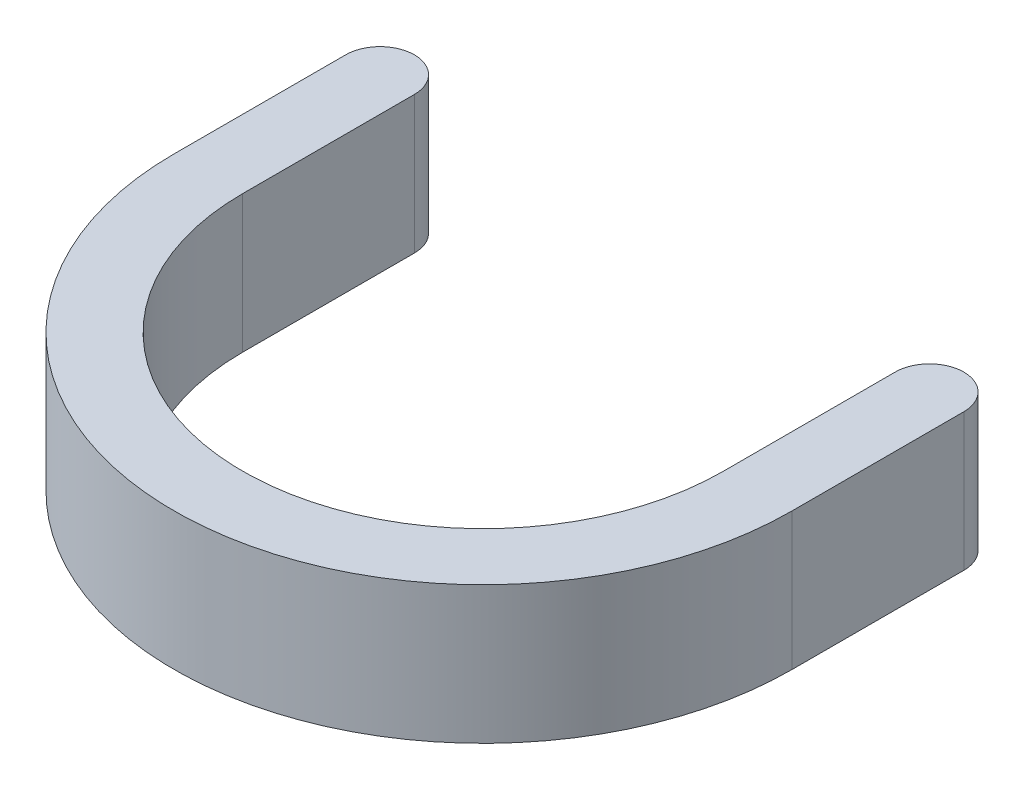
ISO-10303-21;
HEADER;
FILE_DESCRIPTION(('STEP AP214'),'2;1');
FILE_NAME('part.step','',(''),(''),'','','');
FILE_SCHEMA(('AUTOMOTIVE_DESIGN { 1 0 10303 214 1 1 1 1 }'));
ENDSEC;
DATA;
#1=APPLICATION_CONTEXT('core data for automotive mechanical design processes');
#2=APPLICATION_PROTOCOL_DEFINITION('international standard','automotive_design',2000,#1);
#3=PRODUCT_CONTEXT('',#1,'mechanical');
#4=PRODUCT('Part','Part','',(#3));
#5=PRODUCT_RELATED_PRODUCT_CATEGORY('part','',(#4));
#6=PRODUCT_DEFINITION_FORMATION('','',#4);
#7=PRODUCT_DEFINITION_CONTEXT('part definition',#1,'design');
#8=PRODUCT_DEFINITION('design','',#6,#7);
#9=PRODUCT_DEFINITION_SHAPE('','',#8);
#10=(LENGTH_UNIT() NAMED_UNIT(*) SI_UNIT(.MILLI.,.METRE.));
#11=(NAMED_UNIT(*) PLANE_ANGLE_UNIT() SI_UNIT($,.RADIAN.));
#12=(NAMED_UNIT(*) SI_UNIT($,.STERADIAN.) SOLID_ANGLE_UNIT());
#13=UNCERTAINTY_MEASURE_WITH_UNIT(LENGTH_MEASURE(1.E-05),#10,'distance_accuracy_value','');
#14=(GEOMETRIC_REPRESENTATION_CONTEXT(3) GLOBAL_UNCERTAINTY_ASSIGNED_CONTEXT((#13)) GLOBAL_UNIT_ASSIGNED_CONTEXT((#10,
#11,#12)) REPRESENTATION_CONTEXT('',''));
#15=CARTESIAN_POINT('',(0.,0.,0.));
#16=DIRECTION('',(0.,0.,1.));
#17=DIRECTION('',(1.,0.,0.));
#18=AXIS2_PLACEMENT_3D('',#15,#16,#17);
#19=CARTESIAN_POINT('',(8.,4.,-5.));
#20=DIRECTION('',(0.,-1.,0.));
#21=DIRECTION('',(0.,0.,-1.));
#22=AXIS2_PLACEMENT_3D('',#19,#20,#21);
#23=CYLINDRICAL_SURFACE('',#22,1.);
#24=CARTESIAN_POINT('',(8.,0.,-5.));
#25=DIRECTION('',(0.,1.,0.));
#26=DIRECTION('',(0.,0.,1.));
#27=AXIS2_PLACEMENT_3D('',#24,#25,#26);
#28=CIRCLE('',#27,1.);
#29=CARTESIAN_POINT('',(9.,0.,-5.));
#30=VERTEX_POINT('',#29);
#31=CARTESIAN_POINT('',(7.,0.,-5.));
#32=VERTEX_POINT('',#31);
#33=EDGE_CURVE('E128',#30,#32,#28,.T.);
#34=ORIENTED_EDGE('',*,*,#33,.T.);
#35=DIRECTION('',(0.,-1.,0.));
#36=VECTOR('',#35,1.);
#37=CARTESIAN_POINT('',(7.,4.,-5.));
#38=LINE('',#37,#36);
#39=CARTESIAN_POINT('',(7.,4.,-5.));
#40=VERTEX_POINT('',#39);
#41=EDGE_CURVE('E11',#40,#32,#38,.T.);
#42=ORIENTED_EDGE('',*,*,#41,.F.);
#43=CARTESIAN_POINT('',(8.,4.,-5.));
#44=DIRECTION('',(0.,1.,0.));
#45=DIRECTION('',(0.,0.,1.));
#46=AXIS2_PLACEMENT_3D('',#43,#44,#45);
#47=CIRCLE('',#46,1.);
#48=CARTESIAN_POINT('',(9.,4.,-5.));
#49=VERTEX_POINT('',#48);
#50=EDGE_CURVE('E142',#49,#40,#47,.T.);
#51=ORIENTED_EDGE('',*,*,#50,.F.);
#52=DIRECTION('',(0.,-1.,0.));
#53=VECTOR('',#52,1.);
#54=CARTESIAN_POINT('',(9.,4.,-5.));
#55=LINE('',#54,#53);
#56=EDGE_CURVE('E124',#49,#30,#55,.T.);
#57=ORIENTED_EDGE('',*,*,#56,.T.);
#58=EDGE_LOOP('',(#34,#42,#51,#57));
#59=FACE_BOUND('',#58,.T.);
#60=ADVANCED_FACE('F32',(#59),#23,.T.);
#61=CARTESIAN_POINT('',(7.,4.,0.));
#62=DIRECTION('',(1.,0.,0.));
#63=DIRECTION('',(0.,0.,-1.));
#64=AXIS2_PLACEMENT_3D('',#61,#62,#63);
#65=PLANE('',#64);
#66=DIRECTION('',(0.,0.,1.));
#67=VECTOR('',#66,1.);
#68=CARTESIAN_POINT('',(7.,0.,0.));
#69=LINE('',#68,#67);
#70=CARTESIAN_POINT('',(7.,0.,0.));
#71=VERTEX_POINT('',#70);
#72=EDGE_CURVE('E131',#32,#71,#69,.T.);
#73=ORIENTED_EDGE('',*,*,#72,.T.);
#74=DIRECTION('',(0.,-1.,0.));
#75=VECTOR('',#74,1.);
#76=CARTESIAN_POINT('',(7.,4.,0.));
#77=LINE('',#76,#75);
#78=CARTESIAN_POINT('',(7.,4.,0.));
#79=VERTEX_POINT('',#78);
#80=EDGE_CURVE('E40',#79,#71,#77,.T.);
#81=ORIENTED_EDGE('',*,*,#80,.F.);
#82=DIRECTION('',(0.,0.,1.));
#83=VECTOR('',#82,1.);
#84=CARTESIAN_POINT('',(7.,4.,0.));
#85=LINE('',#84,#83);
#86=EDGE_CURVE('E91',#40,#79,#85,.T.);
#87=ORIENTED_EDGE('',*,*,#86,.F.);
#88=ORIENTED_EDGE('',*,*,#41,.T.);
#89=EDGE_LOOP('',(#73,#81,#87,#88));
#90=FACE_BOUND('',#89,.T.);
#91=ADVANCED_FACE('F177',(#90),#65,.F.);
#92=CARTESIAN_POINT('',(0.,4.,0.));
#93=DIRECTION('',(0.,-1.,0.));
#94=DIRECTION('',(0.,0.,-1.));
#95=AXIS2_PLACEMENT_3D('',#92,#93,#94);
#96=CYLINDRICAL_SURFACE('',#95,7.);
#97=CARTESIAN_POINT('',(0.,0.,0.));
#98=DIRECTION('',(0.,-1.,0.));
#99=DIRECTION('',(0.,0.,1.));
#100=AXIS2_PLACEMENT_3D('',#97,#98,#99);
#101=CIRCLE('',#100,7.);
#102=CARTESIAN_POINT('',(-7.,0.,0.));
#103=VERTEX_POINT('',#102);
#104=EDGE_CURVE('E133',#71,#103,#101,.T.);
#105=ORIENTED_EDGE('',*,*,#104,.T.);
#106=DIRECTION('',(0.,-1.,0.));
#107=VECTOR('',#106,1.);
#108=CARTESIAN_POINT('',(-7.,4.,0.));
#109=LINE('',#108,#107);
#110=CARTESIAN_POINT('',(-7.,4.,0.));
#111=VERTEX_POINT('',#110);
#112=EDGE_CURVE('E149',#111,#103,#109,.T.);
#113=ORIENTED_EDGE('',*,*,#112,.F.);
#114=CARTESIAN_POINT('',(0.,4.,0.));
#115=DIRECTION('',(0.,-1.,0.));
#116=DIRECTION('',(0.,0.,1.));
#117=AXIS2_PLACEMENT_3D('',#114,#115,#116);
#118=CIRCLE('',#117,7.);
#119=EDGE_CURVE('E157',#79,#111,#118,.T.);
#120=ORIENTED_EDGE('',*,*,#119,.F.);
#121=ORIENTED_EDGE('',*,*,#80,.T.);
#122=EDGE_LOOP('',(#105,#113,#120,#121));
#123=FACE_BOUND('',#122,.T.);
#124=ADVANCED_FACE('F155',(#123),#96,.F.);
#125=CARTESIAN_POINT('',(-7.,4.,0.));
#126=DIRECTION('',(-1.,0.,0.));
#127=DIRECTION('',(0.,0.,1.));
#128=AXIS2_PLACEMENT_3D('',#125,#126,#127);
#129=PLANE('',#128);
#130=DIRECTION('',(0.,0.,-1.));
#131=VECTOR('',#130,1.);
#132=CARTESIAN_POINT('',(-7.,0.,0.));
#133=LINE('',#132,#131);
#134=CARTESIAN_POINT('',(-7.,0.,-5.));
#135=VERTEX_POINT('',#134);
#136=EDGE_CURVE('E135',#103,#135,#133,.T.);
#137=ORIENTED_EDGE('',*,*,#136,.T.);
#138=DIRECTION('',(0.,-1.,0.));
#139=VECTOR('',#138,1.);
#140=CARTESIAN_POINT('',(-7.,4.,-5.));
#141=LINE('',#140,#139);
#142=CARTESIAN_POINT('',(-7.,4.,-5.));
#143=VERTEX_POINT('',#142);
#144=EDGE_CURVE('E146',#143,#135,#141,.T.);
#145=ORIENTED_EDGE('',*,*,#144,.F.);
#146=DIRECTION('',(0.,0.,-1.));
#147=VECTOR('',#146,1.);
#148=CARTESIAN_POINT('',(-7.,4.,0.));
#149=LINE('',#148,#147);
#150=EDGE_CURVE('E169',#111,#143,#149,.T.);
#151=ORIENTED_EDGE('',*,*,#150,.F.);
#152=ORIENTED_EDGE('',*,*,#112,.T.);
#153=EDGE_LOOP('',(#137,#145,#151,#152));
#154=FACE_BOUND('',#153,.T.);
#155=ADVANCED_FACE('F165',(#154),#129,.F.);
#156=CARTESIAN_POINT('',(-8.,4.,-5.));
#157=DIRECTION('',(0.,-1.,0.));
#158=DIRECTION('',(0.,0.,-1.));
#159=AXIS2_PLACEMENT_3D('',#156,#157,#158);
#160=CYLINDRICAL_SURFACE('',#159,1.);
#161=CARTESIAN_POINT('',(-8.,0.,-5.));
#162=DIRECTION('',(0.,1.,0.));
#163=DIRECTION('',(0.,0.,1.));
#164=AXIS2_PLACEMENT_3D('',#161,#162,#163);
#165=CIRCLE('',#164,1.);
#166=CARTESIAN_POINT('',(-9.,0.,-5.));
#167=VERTEX_POINT('',#166);
#168=EDGE_CURVE('E137',#135,#167,#165,.T.);
#169=ORIENTED_EDGE('',*,*,#168,.T.);
#170=DIRECTION('',(0.,-1.,0.));
#171=VECTOR('',#170,1.);
#172=CARTESIAN_POINT('',(-9.,4.,-5.));
#173=LINE('',#172,#171);
#174=CARTESIAN_POINT('',(-9.,4.,-5.));
#175=VERTEX_POINT('',#174);
#176=EDGE_CURVE('E119',#175,#167,#173,.T.);
#177=ORIENTED_EDGE('',*,*,#176,.F.);
#178=CARTESIAN_POINT('',(-8.,4.,-5.));
#179=DIRECTION('',(0.,1.,0.));
#180=DIRECTION('',(0.,0.,1.));
#181=AXIS2_PLACEMENT_3D('',#178,#179,#180);
#182=CIRCLE('',#181,1.);
#183=EDGE_CURVE('E110',#143,#175,#182,.T.);
#184=ORIENTED_EDGE('',*,*,#183,.F.);
#185=ORIENTED_EDGE('',*,*,#144,.T.);
#186=EDGE_LOOP('',(#169,#177,#184,#185));
#187=FACE_BOUND('',#186,.T.);
#188=ADVANCED_FACE('F168',(#187),#160,.T.);
#189=CARTESIAN_POINT('',(-9.,4.,-5.));
#190=DIRECTION('',(1.,0.,0.));
#191=DIRECTION('',(0.,0.,-1.));
#192=AXIS2_PLACEMENT_3D('',#189,#190,#191);
#193=PLANE('',#192);
#194=DIRECTION('',(0.,0.,1.));
#195=VECTOR('',#194,1.);
#196=CARTESIAN_POINT('',(-9.,0.,-5.));
#197=LINE('',#196,#195);
#198=CARTESIAN_POINT('',(-9.,0.,0.));
#199=VERTEX_POINT('',#198);
#200=EDGE_CURVE('E118',#167,#199,#197,.T.);
#201=ORIENTED_EDGE('',*,*,#200,.T.);
#202=DIRECTION('',(0.,-1.,0.));
#203=VECTOR('',#202,1.);
#204=CARTESIAN_POINT('',(-9.,4.,0.));
#205=LINE('',#204,#203);
#206=CARTESIAN_POINT('',(-9.,4.,0.));
#207=VERTEX_POINT('',#206);
#208=EDGE_CURVE('E115',#207,#199,#205,.T.);
#209=ORIENTED_EDGE('',*,*,#208,.F.);
#210=DIRECTION('',(0.,0.,1.));
#211=VECTOR('',#210,1.);
#212=CARTESIAN_POINT('',(-9.,4.,-5.));
#213=LINE('',#212,#211);
#214=EDGE_CURVE('E104',#175,#207,#213,.T.);
#215=ORIENTED_EDGE('',*,*,#214,.F.);
#216=ORIENTED_EDGE('',*,*,#176,.T.);
#217=EDGE_LOOP('',(#201,#209,#215,#216));
#218=FACE_BOUND('',#217,.T.);
#219=ADVANCED_FACE('F116',(#218),#193,.F.);
#220=CARTESIAN_POINT('',(0.,4.,0.));
#221=DIRECTION('',(0.,-1.,0.));
#222=DIRECTION('',(0.,0.,-1.));
#223=AXIS2_PLACEMENT_3D('',#220,#221,#222);
#224=CYLINDRICAL_SURFACE('',#223,9.);
#225=CARTESIAN_POINT('',(0.,0.,0.));
#226=DIRECTION('',(0.,1.,0.));
#227=DIRECTION('',(0.,0.,1.));
#228=AXIS2_PLACEMENT_3D('',#225,#226,#227);
#229=CIRCLE('',#228,9.);
#230=CARTESIAN_POINT('',(9.,0.,0.));
#231=VERTEX_POINT('',#230);
#232=EDGE_CURVE('E77',#199,#231,#229,.T.);
#233=ORIENTED_EDGE('',*,*,#232,.T.);
#234=DIRECTION('',(0.,-1.,0.));
#235=VECTOR('',#234,1.);
#236=CARTESIAN_POINT('',(9.,4.,0.));
#237=LINE('',#236,#235);
#238=CARTESIAN_POINT('',(9.,4.,0.));
#239=VERTEX_POINT('',#238);
#240=EDGE_CURVE('E120',#239,#231,#237,.T.);
#241=ORIENTED_EDGE('',*,*,#240,.F.);
#242=CARTESIAN_POINT('',(0.,4.,0.));
#243=DIRECTION('',(0.,1.,0.));
#244=DIRECTION('',(0.,0.,1.));
#245=AXIS2_PLACEMENT_3D('',#242,#243,#244);
#246=CIRCLE('',#245,9.);
#247=EDGE_CURVE('E108',#207,#239,#246,.T.);
#248=ORIENTED_EDGE('',*,*,#247,.F.);
#249=ORIENTED_EDGE('',*,*,#208,.T.);
#250=EDGE_LOOP('',(#233,#241,#248,#249));
#251=FACE_BOUND('',#250,.T.);
#252=ADVANCED_FACE('F122',(#251),#224,.T.);
#253=CARTESIAN_POINT('',(9.,4.,0.));
#254=DIRECTION('',(-1.,0.,0.));
#255=DIRECTION('',(0.,0.,1.));
#256=AXIS2_PLACEMENT_3D('',#253,#254,#255);
#257=PLANE('',#256);
#258=DIRECTION('',(0.,0.,-1.));
#259=VECTOR('',#258,1.);
#260=CARTESIAN_POINT('',(9.,0.,0.));
#261=LINE('',#260,#259);
#262=EDGE_CURVE('E83',#231,#30,#261,.T.);
#263=ORIENTED_EDGE('',*,*,#262,.T.);
#264=ORIENTED_EDGE('',*,*,#56,.F.);
#265=DIRECTION('',(0.,0.,-1.));
#266=VECTOR('',#265,1.);
#267=CARTESIAN_POINT('',(9.,4.,0.));
#268=LINE('',#267,#266);
#269=EDGE_CURVE('E48',#239,#49,#268,.T.);
#270=ORIENTED_EDGE('',*,*,#269,.F.);
#271=ORIENTED_EDGE('',*,*,#240,.T.);
#272=EDGE_LOOP('',(#263,#264,#270,#271));
#273=FACE_BOUND('',#272,.T.);
#274=ADVANCED_FACE('F193',(#273),#257,.F.);
#275=CARTESIAN_POINT('',(8.,4.,-5.));
#276=DIRECTION('',(0.,1.,0.));
#277=DIRECTION('',(0.,0.,1.));
#278=AXIS2_PLACEMENT_3D('',#275,#276,#277);
#279=PLANE('',#278);
#280=ORIENTED_EDGE('',*,*,#50,.T.);
#281=ORIENTED_EDGE('',*,*,#86,.T.);
#282=ORIENTED_EDGE('',*,*,#119,.T.);
#283=ORIENTED_EDGE('',*,*,#150,.T.);
#284=ORIENTED_EDGE('',*,*,#183,.T.);
#285=ORIENTED_EDGE('',*,*,#214,.T.);
#286=ORIENTED_EDGE('',*,*,#247,.T.);
#287=ORIENTED_EDGE('',*,*,#269,.T.);
#288=EDGE_LOOP('',(#280,#281,#282,#283,#284,#285,#286,#287));
#289=FACE_BOUND('',#288,.T.);
#290=ADVANCED_FACE('F106',(#289),#279,.T.);
#291=CARTESIAN_POINT('',(8.,0.,-5.));
#292=DIRECTION('',(0.,1.,0.));
#293=DIRECTION('',(0.,0.,1.));
#294=AXIS2_PLACEMENT_3D('',#291,#292,#293);
#295=PLANE('',#294);
#296=ORIENTED_EDGE('',*,*,#33,.F.);
#297=ORIENTED_EDGE('',*,*,#262,.F.);
#298=ORIENTED_EDGE('',*,*,#232,.F.);
#299=ORIENTED_EDGE('',*,*,#200,.F.);
#300=ORIENTED_EDGE('',*,*,#168,.F.);
#301=ORIENTED_EDGE('',*,*,#136,.F.);
#302=ORIENTED_EDGE('',*,*,#104,.F.);
#303=ORIENTED_EDGE('',*,*,#72,.F.);
#304=EDGE_LOOP('',(#296,#297,#298,#299,#300,#301,#302,#303));
#305=FACE_BOUND('',#304,.T.);
#306=ADVANCED_FACE('F161',(#305),#295,.F.);
#307=CLOSED_SHELL('',(#60,#91,#124,#155,#188,#219,#252,#274,#290,#306));
#308=MANIFOLD_SOLID_BREP('B2',#307);
#309=ADVANCED_BREP_SHAPE_REPRESENTATION('',(#18,#308),#14);
#310=SHAPE_DEFINITION_REPRESENTATION(#9,#309);
ENDSEC;
END-ISO-10303-21;
